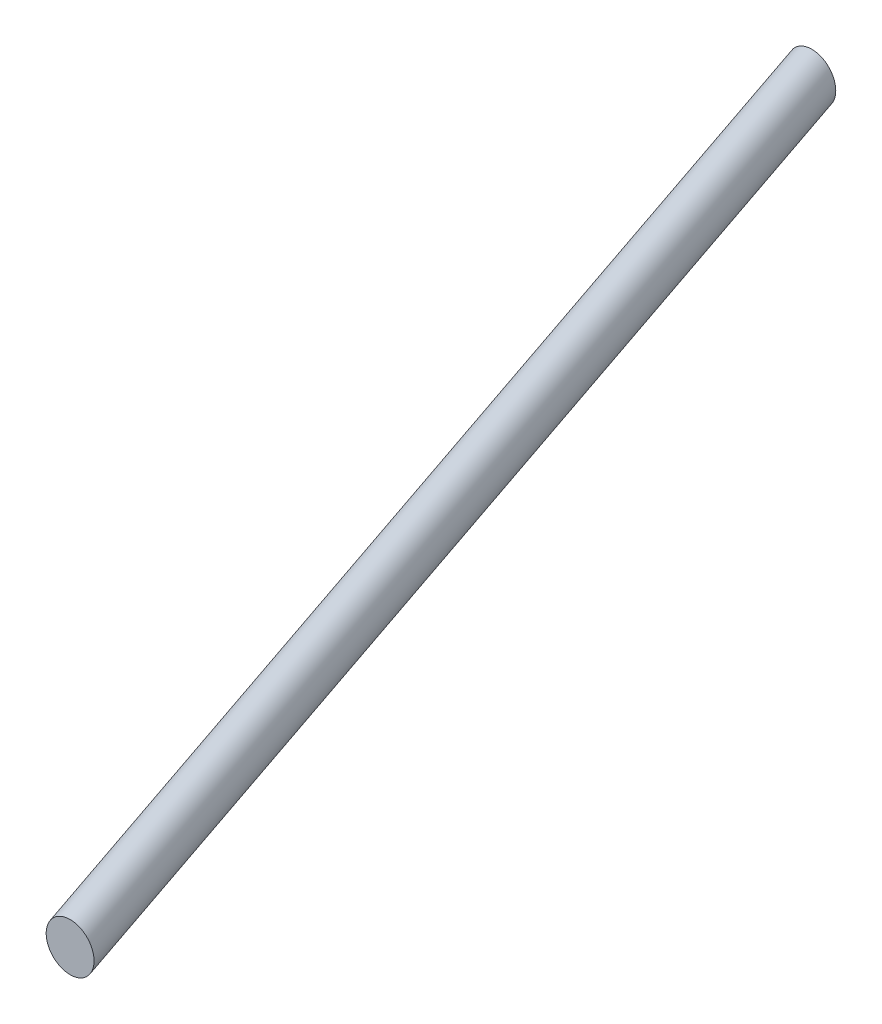
ISO-10303-21;
HEADER;
FILE_DESCRIPTION(('STEP AP214'),'2;1');
FILE_NAME('part.step','',(''),(''),'','','');
FILE_SCHEMA(('AUTOMOTIVE_DESIGN { 1 0 10303 214 1 1 1 1 }'));
ENDSEC;
DATA;
#1=APPLICATION_CONTEXT('core data for automotive mechanical design processes');
#2=APPLICATION_PROTOCOL_DEFINITION('international standard','automotive_design',2000,#1);
#3=PRODUCT_CONTEXT('',#1,'mechanical');
#4=PRODUCT('Part','Part','',(#3));
#5=PRODUCT_RELATED_PRODUCT_CATEGORY('part','',(#4));
#6=PRODUCT_DEFINITION_FORMATION('','',#4);
#7=PRODUCT_DEFINITION_CONTEXT('part definition',#1,'design');
#8=PRODUCT_DEFINITION('design','',#6,#7);
#9=PRODUCT_DEFINITION_SHAPE('','',#8);
#10=(LENGTH_UNIT() NAMED_UNIT(*) SI_UNIT(.MILLI.,.METRE.));
#11=(NAMED_UNIT(*) PLANE_ANGLE_UNIT() SI_UNIT($,.RADIAN.));
#12=(NAMED_UNIT(*) SI_UNIT($,.STERADIAN.) SOLID_ANGLE_UNIT());
#13=UNCERTAINTY_MEASURE_WITH_UNIT(LENGTH_MEASURE(1.E-05),#10,'distance_accuracy_value','');
#14=(GEOMETRIC_REPRESENTATION_CONTEXT(3) GLOBAL_UNCERTAINTY_ASSIGNED_CONTEXT((#13)) GLOBAL_UNIT_ASSIGNED_CONTEXT((#10,
#11,#12)) REPRESENTATION_CONTEXT('',''));
#15=CARTESIAN_POINT('',(0.,0.,0.));
#16=DIRECTION('',(0.,0.,1.));
#17=DIRECTION('',(1.,0.,0.));
#18=AXIS2_PLACEMENT_3D('',#15,#16,#17);
#19=CARTESIAN_POINT('',(-0.0757874118222803,2.49885098959688,0.));
#20=CARTESIAN_POINT('',(39.9304624300347,2.49903271814583,117.5));
#21=CARTESIAN_POINT('',(-0.402886241461161,2.4889304405879,0.));
#22=CARTESIAN_POINT('',(39.6033398121844,2.48993027152285,117.5));
#23=CARTESIAN_POINT('',(-1.0531425357779,2.33913525789537,0.));
#24=CARTESIAN_POINT('',(38.9527109150701,2.34176184271176,117.5));
#25=CARTESIAN_POINT('',(-1.86803152179888,1.75797077810609,0.));
#26=CARTESIAN_POINT('',(38.1363709902358,1.76263721085043,117.5));
#27=CARTESIAN_POINT('',(-2.39857395561216,0.909368761930943,0.));
#28=CARTESIAN_POINT('',(37.6037078693416,0.915364730728332,117.5));
#29=CARTESIAN_POINT('',(-2.56399839870737,-0.0777716640912207,0.));
#30=CARTESIAN_POINT('',(37.4358151138933,-0.0713588829186547,117.5));
#31=CARTESIAN_POINT('',(-2.33905993096638,-1.05303583895757,0.));
#32=CARTESIAN_POINT('',(37.6583137508295,-1.0471825768352,117.5));
#33=CARTESIAN_POINT('',(-1.75805179550686,-1.86797811736863,0.));
#34=CARTESIAN_POINT('',(38.2372819055662,-1.86357540287713,117.5));
#35=CARTESIAN_POINT('',(-0.9093657149284,-2.39858902540987,0.));
#36=CARTESIAN_POINT('',(39.0846382785752,-2.39630720802952,117.5));
#37=CARTESIAN_POINT('',(0.0777628159750224,-2.56398371419118,0.));
#38=CARTESIAN_POINT('',(40.0713500715561,-2.56417017950738,117.5));
#39=CARTESIAN_POINT('',(1.05305375092709,-2.33907099378412,0.));
#40=CARTESIAN_POINT('',(41.0472004610805,-2.34169735675134,117.5));
#41=CARTESIAN_POINT('',(1.86802383539104,-1.75800321759203,0.));
#42=CARTESIAN_POINT('',(41.8636212422496,-1.76266963101128,117.5));
#43=CARTESIAN_POINT('',(2.39857689742318,-0.909348506310552,0.));
#44=CARTESIAN_POINT('',(42.3962951231193,-0.915344482528727,117.5));
#45=CARTESIAN_POINT('',(2.56399890793142,0.0777548740335864,0.));
#46=CARTESIAN_POINT('',(42.5641853533375,0.0713420916399626,117.5));
#47=CARTESIAN_POINT('',(2.33905576702997,1.05305587906844,0.));
#48=CARTESIAN_POINT('',(42.3416821353672,1.04720262729736,117.5));
#49=CARTESIAN_POINT('',(1.75806143368693,1.86794620331845,0.));
#50=CARTESIAN_POINT('',(41.762727652767,1.86354346482175,117.5));
#51=CARTESIAN_POINT('',(0.909450442055384,2.39865855194924,0.));
#52=CARTESIAN_POINT('',(40.915446622172,2.39637652244963,117.5));
#53=CARTESIAN_POINT('',(0.2513114178166,2.50877153860585,0.));
#54=CARTESIAN_POINT('',(40.257585047885,2.50813516476881,117.5));
#55=CARTESIAN_POINT('',(-0.0757874118222803,2.49885098959688,0.));
#56=CARTESIAN_POINT('',(39.9304624300347,2.49903271814583,117.5));
#57=B_SPLINE_SURFACE_WITH_KNOTS('',3,1,((#19,#20),(#21,#22),(#23,#24),(#25,#26),(#27,#28),(#29,
#30),(#31,#32),(#33,#34),(#35,#36),(#37,#38),(#39,#40),(#41,#42),(#43,#44),(#45,#46),(#47,#48),
(#49,#50),(#51,#52),(#53,#54),(#55,#56)),.UNSPECIFIED.,.T.,.F.,.F.,(4,1,1,1,1,1,1,1,1,1,1,1,1,1,
1,1,4),(2,2),(0.,0.0625,0.125,0.1875,0.25,0.3125,0.375,0.4375,0.5,0.5625,0.625,0.6875,0.75,
0.8125,0.875,0.9375,1.),(0.,1.),.UNSPECIFIED.);
#58=CARTESIAN_POINT('',(0.,0.,0.));
#59=DIRECTION('',(0.,0.,1.));
#60=DIRECTION('',(1.,0.,0.));
#61=AXIS2_PLACEMENT_3D('',#58,#59,#60);
#62=CIRCLE('',#61,2.5);
#63=CARTESIAN_POINT('',(-0.0757874118222803,2.49885098959688,0.));
#64=VERTEX_POINT('',#63);
#65=EDGE_CURVE('E11',#64,#64,#62,.T.);
#66=CARTESIAN_POINT('',(40.,0.,117.5));
#67=DIRECTION('',(0.,0.,1.));
#68=DIRECTION('',(1.,0.,0.));
#69=AXIS2_PLACEMENT_3D('',#66,#67,#68);
#70=CIRCLE('',#69,2.5);
#71=CARTESIAN_POINT('',(39.9304624300347,2.49903271814583,117.5));
#72=VERTEX_POINT('',#71);
#73=EDGE_CURVE('E68',#72,#72,#70,.T.);
#74=CARTESIAN_POINT('',(-0.0757874118222803,2.49885098959688,0.));
#75=CARTESIAN_POINT('',(0.340944357363729,2.49885288260259,1.22395833333333));
#76=CARTESIAN_POINT('',(0.75767612654974,2.49885477560831,2.44791666666667));
#77=CARTESIAN_POINT('',(1.59113966492176,2.49885856161975,4.89583333333333));
#78=CARTESIAN_POINT('',(2.00787143410777,2.49886045462547,6.11979166666667));
#79=CARTESIAN_POINT('',(2.84133497247979,2.4988642406369,8.56770833333333));
#80=CARTESIAN_POINT('',(3.2580667416658,2.49886613364262,9.79166666666667));
#81=CARTESIAN_POINT('',(4.09153028003782,2.49886991965406,12.2395833333333));
#82=CARTESIAN_POINT('',(4.50826204922383,2.49887181265978,13.4635416666667));
#83=CARTESIAN_POINT('',(5.34172558759585,2.49887559867121,15.9114583333333));
#84=CARTESIAN_POINT('',(5.75845735678186,2.49887749167693,17.1354166666667));
#85=CARTESIAN_POINT('',(6.59192089515388,2.49888127768837,19.5833333333333));
#86=CARTESIAN_POINT('',(7.00865266433989,2.49888317069409,20.8072916666667));
#87=CARTESIAN_POINT('',(7.84211620271191,2.49888695670552,23.2552083333333));
#88=CARTESIAN_POINT('',(8.25884797189793,2.49888884971124,24.4791666666667));
#89=CARTESIAN_POINT('',(9.09231151026995,2.49889263572268,26.9270833333333));
#90=CARTESIAN_POINT('',(9.50904327945596,2.4988945287284,28.1510416666667));
#91=CARTESIAN_POINT('',(10.342506817828,2.49889831473983,30.5989583333333));
#92=CARTESIAN_POINT('',(10.759238587014,2.49890020774555,31.8229166666667));
#93=CARTESIAN_POINT('',(11.592702125386,2.49890399375699,34.2708333333333));
#94=CARTESIAN_POINT('',(12.009433894572,2.49890588676271,35.4947916666667));
#95=CARTESIAN_POINT('',(12.842897432944,2.49890967277414,37.9427083333333));
#96=CARTESIAN_POINT('',(13.25962920213,2.49891156577986,39.1666666666667));
#97=CARTESIAN_POINT('',(14.0930927405021,2.4989153517913,41.6145833333333));
#98=CARTESIAN_POINT('',(14.5098245096881,2.49891724479701,42.8385416666667));
#99=CARTESIAN_POINT('',(15.3432880480601,2.49892103080845,45.2864583333333));
#100=CARTESIAN_POINT('',(15.7600198172461,2.49892292381417,46.5104166666667));
#101=CARTESIAN_POINT('',(16.5934833556181,2.49892670982561,48.9583333333333));
#102=CARTESIAN_POINT('',(17.0102151248041,2.49892860283132,50.1822916666667));
#103=CARTESIAN_POINT('',(17.8436786631762,2.49893238884276,52.6302083333333));
#104=CARTESIAN_POINT('',(18.2604104323622,2.49893428184848,53.8541666666667));
#105=CARTESIAN_POINT('',(19.0938739707342,2.49893806785992,56.3020833333333));
#106=CARTESIAN_POINT('',(19.5106057399202,2.49893996086563,57.5260416666667));
#107=CARTESIAN_POINT('',(20.3440692782922,2.49894374687707,59.9739583333333));
#108=CARTESIAN_POINT('',(20.7608010474782,2.49894563988279,61.1979166666667));
#109=CARTESIAN_POINT('',(21.5942645858503,2.49894942589423,63.6458333333333));
#110=CARTESIAN_POINT('',(22.0109963550363,2.49895131889994,64.8697916666667));
#111=CARTESIAN_POINT('',(22.8444598934083,2.49895510491138,67.3177083333333));
#112=CARTESIAN_POINT('',(23.2611916625943,2.4989569979171,68.5416666666667));
#113=CARTESIAN_POINT('',(24.0946552009663,2.49896078392853,70.9895833333333));
#114=CARTESIAN_POINT('',(24.5113869701523,2.49896267693425,72.2135416666667));
#115=CARTESIAN_POINT('',(25.3448505085243,2.49896646294569,74.6614583333333));
#116=CARTESIAN_POINT('',(25.7615822777104,2.49896835595141,75.8854166666667));
#117=CARTESIAN_POINT('',(26.5950458160824,2.49897214196284,78.3333333333333));
#118=CARTESIAN_POINT('',(27.0117775852684,2.49897403496856,79.5572916666667));
#119=CARTESIAN_POINT('',(27.8452411236404,2.49897782098,82.0052083333333));
#120=CARTESIAN_POINT('',(28.2619728928264,2.49897971398572,83.2291666666667));
#121=CARTESIAN_POINT('',(29.0954364311984,2.49898349999715,85.6770833333333));
#122=CARTESIAN_POINT('',(29.5121682003845,2.49898539300287,86.9010416666667));
#123=CARTESIAN_POINT('',(30.3456317387565,2.49898917901431,89.3489583333333));
#124=CARTESIAN_POINT('',(30.7623635079425,2.49899107202003,90.5729166666667));
#125=CARTESIAN_POINT('',(31.5958270463145,2.49899485803146,93.0208333333333));
#126=CARTESIAN_POINT('',(32.0125588155005,2.49899675103718,94.2447916666667));
#127=CARTESIAN_POINT('',(32.8460223538725,2.49900053704862,96.6927083333333));
#128=CARTESIAN_POINT('',(33.2627541230585,2.49900243005434,97.9166666666667));
#129=CARTESIAN_POINT('',(34.0962176614306,2.49900621606577,100.364583333333));
#130=CARTESIAN_POINT('',(34.5129494306166,2.49900810907149,101.588541666667));
#131=CARTESIAN_POINT('',(35.3464129689886,2.49901189508293,104.036458333333));
#132=CARTESIAN_POINT('',(35.7631447381746,2.49901378808865,105.260416666667));
#133=CARTESIAN_POINT('',(36.5966082765466,2.49901757410008,107.708333333333));
#134=CARTESIAN_POINT('',(37.0133400457326,2.4990194671058,108.932291666667));
#135=CARTESIAN_POINT('',(37.8468035841046,2.49902325311724,111.380208333333));
#136=CARTESIAN_POINT('',(38.2635353532907,2.49902514612296,112.604166666667));
#137=CARTESIAN_POINT('',(39.0969988916627,2.49902893213439,115.052083333333));
#138=CARTESIAN_POINT('',(39.5137306608487,2.49903082514011,116.276041666667));
#139=CARTESIAN_POINT('',(39.9304624300347,2.49903271814583,117.5));
#140=B_SPLINE_CURVE_WITH_KNOTS('',3,(#74,#75,#76,#77,#78,#79,#80,#81,#82,#83,#84,#85,#86,#87,
#88,#89,#90,#91,#92,#93,#94,#95,#96,#97,#98,#99,#100,#101,#102,#103,#104,#105,#106,#107,#108,
#109,#110,#111,#112,#113,#114,#115,#116,#117,#118,#119,#120,#121,#122,#123,#124,#125,#126,#127,
#128,#129,#130,#131,#132,#133,#134,#135,#136,#137,#138,#139),.UNSPECIFIED.,.F.,.F.,(4,2,2,2,2,2,
2,2,2,2,2,2,2,2,2,2,2,2,2,2,2,2,2,2,2,2,2,2,2,2,2,2,4),(0.,3.87887281599918,7.75774563199835,
11.6366184479975,15.5154912639967,19.3943640799959,23.2732368959951,27.1521097119942,
31.0309825279934,34.9098553439926,38.7887281599917,42.6676009759909,46.5464737919901,
50.4253466079893,54.3042194239885,58.1830922399876,62.0619650559868,65.940837871986,
69.8197106879852,73.6985835039843,77.5774563199835,81.4563291359827,85.3352019519818,
89.214074767981,93.0929475839802,96.9718203999794,100.850693215979,104.729566031978,
108.608438847977,112.487311663976,116.366184479975,120.245057295974,124.123930111974),.UNSPECIFIED.);
#141=EDGE_CURVE('BSEAM59',#64,#72,#140,.T.);
#142=ORIENTED_EDGE('',*,*,#65,.T.);
#143=ORIENTED_EDGE('',*,*,#73,.F.);
#144=ORIENTED_EDGE('',*,*,#141,.T.);
#145=ORIENTED_EDGE('',*,*,#141,.F.);
#146=EDGE_LOOP('',(#142,#144,#143,#145));
#147=FACE_BOUND('',#146,.T.);
#148=ADVANCED_FACE('F59',(#147),#57,.T.);
#149=CARTESIAN_POINT('',(0.,0.,0.));
#150=DIRECTION('',(0.,0.,1.));
#151=DIRECTION('',(1.,0.,0.));
#152=AXIS2_PLACEMENT_3D('',#149,#150,#151);
#153=PLANE('',#152);
#154=ORIENTED_EDGE('',*,*,#65,.F.);
#155=EDGE_LOOP('',(#154));
#156=FACE_BOUND('',#155,.T.);
#157=ADVANCED_FACE('F106',(#156),#153,.F.);
#158=CARTESIAN_POINT('',(40.,0.,117.5));
#159=DIRECTION('',(0.,0.,1.));
#160=DIRECTION('',(1.,0.,0.));
#161=AXIS2_PLACEMENT_3D('',#158,#159,#160);
#162=PLANE('',#161);
#163=ORIENTED_EDGE('',*,*,#73,.T.);
#164=EDGE_LOOP('',(#163));
#165=FACE_BOUND('',#164,.T.);
#166=ADVANCED_FACE('F61',(#165),#162,.T.);
#167=CLOSED_SHELL('',(#148,#157,#166));
#168=MANIFOLD_SOLID_BREP('B2',#167);
#169=ADVANCED_BREP_SHAPE_REPRESENTATION('',(#18,#168),#14);
#170=SHAPE_DEFINITION_REPRESENTATION(#9,#169);
ENDSEC;
END-ISO-10303-21;
